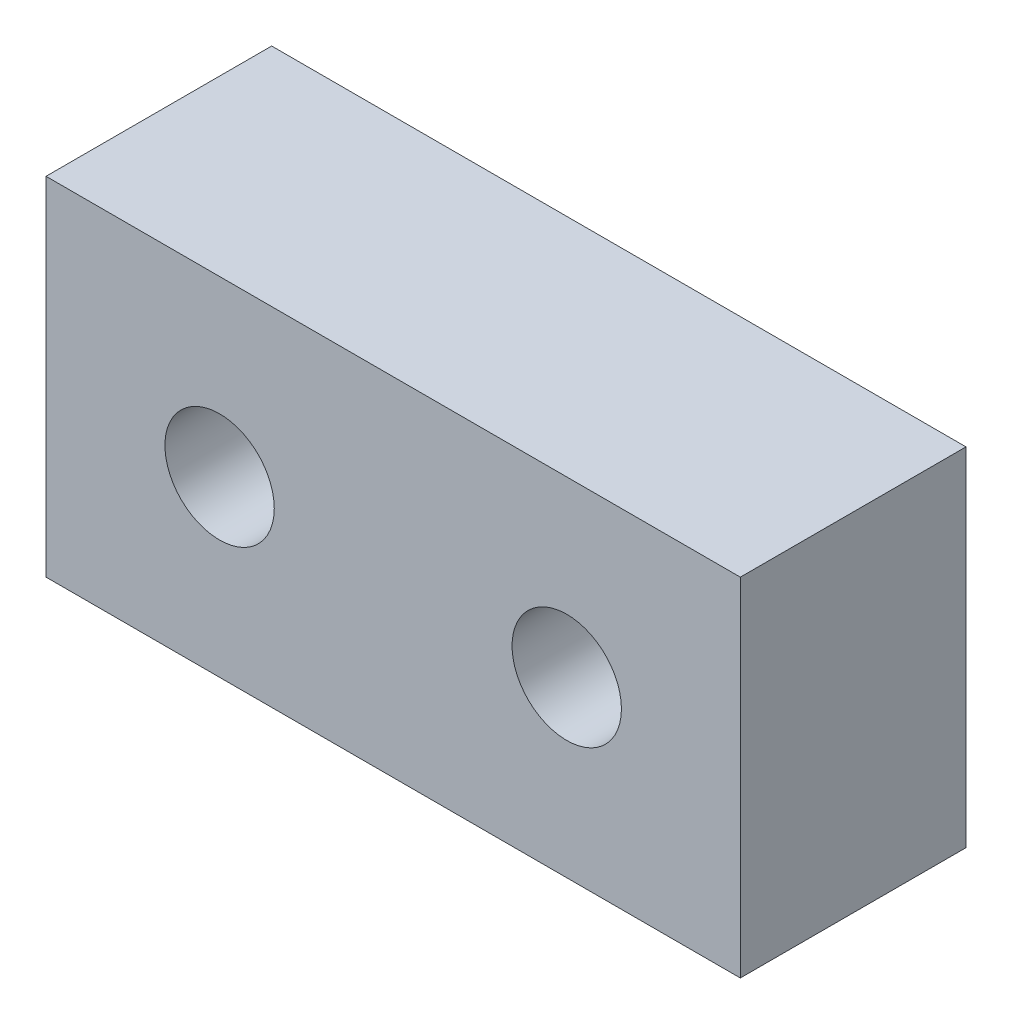
ISO-10303-21;
HEADER;
FILE_DESCRIPTION(('STEP AP214'),'2;1');
FILE_NAME('part.step','',(''),(''),'','','');
FILE_SCHEMA(('AUTOMOTIVE_DESIGN { 1 0 10303 214 1 1 1 1 }'));
ENDSEC;
DATA;
#1=APPLICATION_CONTEXT('core data for automotive mechanical design processes');
#2=APPLICATION_PROTOCOL_DEFINITION('international standard','automotive_design',2000,#1);
#3=PRODUCT_CONTEXT('',#1,'mechanical');
#4=PRODUCT('Part','Part','',(#3));
#5=PRODUCT_RELATED_PRODUCT_CATEGORY('part','',(#4));
#6=PRODUCT_DEFINITION_FORMATION('','',#4);
#7=PRODUCT_DEFINITION_CONTEXT('part definition',#1,'design');
#8=PRODUCT_DEFINITION('design','',#6,#7);
#9=PRODUCT_DEFINITION_SHAPE('','',#8);
#10=(LENGTH_UNIT() NAMED_UNIT(*) SI_UNIT(.MILLI.,.METRE.));
#11=(NAMED_UNIT(*) PLANE_ANGLE_UNIT() SI_UNIT($,.RADIAN.));
#12=(NAMED_UNIT(*) SI_UNIT($,.STERADIAN.) SOLID_ANGLE_UNIT());
#13=UNCERTAINTY_MEASURE_WITH_UNIT(LENGTH_MEASURE(1.E-05),#10,'distance_accuracy_value','');
#14=(GEOMETRIC_REPRESENTATION_CONTEXT(3) GLOBAL_UNCERTAINTY_ASSIGNED_CONTEXT((#13)) GLOBAL_UNIT_ASSIGNED_CONTEXT((#10,
#11,#12)) REPRESENTATION_CONTEXT('',''));
#15=CARTESIAN_POINT('',(0.,0.,0.));
#16=DIRECTION('',(0.,0.,1.));
#17=DIRECTION('',(1.,0.,0.));
#18=AXIS2_PLACEMENT_3D('',#15,#16,#17);
#19=CARTESIAN_POINT('',(0.,0.,6.5));
#20=DIRECTION('',(1.,0.,0.));
#21=DIRECTION('',(0.,0.,-1.));
#22=AXIS2_PLACEMENT_3D('',#19,#20,#21);
#23=PLANE('',#22);
#24=DIRECTION('',(0.,-1.,0.));
#25=VECTOR('',#24,1.);
#26=CARTESIAN_POINT('',(0.,0.,0.));
#27=LINE('',#26,#25);
#28=CARTESIAN_POINT('',(0.,0.,0.));
#29=VERTEX_POINT('',#28);
#30=CARTESIAN_POINT('',(0.,-10.,0.));
#31=VERTEX_POINT('',#30);
#32=EDGE_CURVE('E104',#29,#31,#27,.T.);
#33=ORIENTED_EDGE('',*,*,#32,.T.);
#34=DIRECTION('',(0.,0.,-1.));
#35=VECTOR('',#34,1.);
#36=CARTESIAN_POINT('',(0.,-10.,6.5));
#37=LINE('',#36,#35);
#38=CARTESIAN_POINT('',(0.,-10.,6.5));
#39=VERTEX_POINT('',#38);
#40=EDGE_CURVE('E11',#39,#31,#37,.T.);
#41=ORIENTED_EDGE('',*,*,#40,.F.);
#42=DIRECTION('',(0.,-1.,0.));
#43=VECTOR('',#42,1.);
#44=CARTESIAN_POINT('',(0.,0.,6.5));
#45=LINE('',#44,#43);
#46=CARTESIAN_POINT('',(0.,0.,6.5));
#47=VERTEX_POINT('',#46);
#48=EDGE_CURVE('E92',#47,#39,#45,.T.);
#49=ORIENTED_EDGE('',*,*,#48,.F.);
#50=DIRECTION('',(0.,0.,-1.));
#51=VECTOR('',#50,1.);
#52=CARTESIAN_POINT('',(0.,0.,6.5));
#53=LINE('',#52,#51);
#54=EDGE_CURVE('E100',#47,#29,#53,.T.);
#55=ORIENTED_EDGE('',*,*,#54,.T.);
#56=EDGE_LOOP('',(#33,#41,#49,#55));
#57=FACE_BOUND('',#56,.T.);
#58=ADVANCED_FACE('F41',(#57),#23,.F.);
#59=CARTESIAN_POINT('',(0.,-10.,6.5));
#60=DIRECTION('',(0.,1.,0.));
#61=DIRECTION('',(0.,0.,1.));
#62=AXIS2_PLACEMENT_3D('',#59,#60,#61);
#63=PLANE('',#62);
#64=DIRECTION('',(1.,0.,0.));
#65=VECTOR('',#64,1.);
#66=CARTESIAN_POINT('',(0.,-10.,0.));
#67=LINE('',#66,#65);
#68=CARTESIAN_POINT('',(20.,-10.,0.));
#69=VERTEX_POINT('',#68);
#70=EDGE_CURVE('E96',#31,#69,#67,.T.);
#71=ORIENTED_EDGE('',*,*,#70,.T.);
#72=DIRECTION('',(0.,0.,-1.));
#73=VECTOR('',#72,1.);
#74=CARTESIAN_POINT('',(20.,-10.,6.5));
#75=LINE('',#74,#73);
#76=CARTESIAN_POINT('',(20.,-10.,6.5));
#77=VERTEX_POINT('',#76);
#78=EDGE_CURVE('E49',#77,#69,#75,.T.);
#79=ORIENTED_EDGE('',*,*,#78,.F.);
#80=DIRECTION('',(1.,0.,0.));
#81=VECTOR('',#80,1.);
#82=CARTESIAN_POINT('',(0.,-10.,6.5));
#83=LINE('',#82,#81);
#84=EDGE_CURVE('E87',#39,#77,#83,.T.);
#85=ORIENTED_EDGE('',*,*,#84,.F.);
#86=ORIENTED_EDGE('',*,*,#40,.T.);
#87=EDGE_LOOP('',(#71,#79,#85,#86));
#88=FACE_BOUND('',#87,.T.);
#89=ADVANCED_FACE('F95',(#88),#63,.F.);
#90=CARTESIAN_POINT('',(20.,0.,6.5));
#91=DIRECTION('',(-1.,0.,0.));
#92=DIRECTION('',(0.,0.,1.));
#93=AXIS2_PLACEMENT_3D('',#90,#91,#92);
#94=PLANE('',#93);
#95=DIRECTION('',(0.,1.,0.));
#96=VECTOR('',#95,1.);
#97=CARTESIAN_POINT('',(20.,0.,0.));
#98=LINE('',#97,#96);
#99=CARTESIAN_POINT('',(20.,0.,0.));
#100=VERTEX_POINT('',#99);
#101=EDGE_CURVE('E74',#69,#100,#98,.T.);
#102=ORIENTED_EDGE('',*,*,#101,.T.);
#103=DIRECTION('',(0.,0.,-1.));
#104=VECTOR('',#103,1.);
#105=CARTESIAN_POINT('',(20.,0.,6.5));
#106=LINE('',#105,#104);
#107=CARTESIAN_POINT('',(20.,0.,6.5));
#108=VERTEX_POINT('',#107);
#109=EDGE_CURVE('E97',#108,#100,#106,.T.);
#110=ORIENTED_EDGE('',*,*,#109,.F.);
#111=DIRECTION('',(0.,1.,0.));
#112=VECTOR('',#111,1.);
#113=CARTESIAN_POINT('',(20.,0.,6.5));
#114=LINE('',#113,#112);
#115=EDGE_CURVE('E90',#77,#108,#114,.T.);
#116=ORIENTED_EDGE('',*,*,#115,.F.);
#117=ORIENTED_EDGE('',*,*,#78,.T.);
#118=EDGE_LOOP('',(#102,#110,#116,#117));
#119=FACE_BOUND('',#118,.T.);
#120=ADVANCED_FACE('F98',(#119),#94,.F.);
#121=CARTESIAN_POINT('',(0.,0.,6.5));
#122=DIRECTION('',(0.,-1.,0.));
#123=DIRECTION('',(0.,0.,-1.));
#124=AXIS2_PLACEMENT_3D('',#121,#122,#123);
#125=PLANE('',#124);
#126=DIRECTION('',(-1.,0.,0.));
#127=VECTOR('',#126,1.);
#128=CARTESIAN_POINT('',(0.,0.,0.));
#129=LINE('',#128,#127);
#130=EDGE_CURVE('E80',#100,#29,#129,.T.);
#131=ORIENTED_EDGE('',*,*,#130,.T.);
#132=ORIENTED_EDGE('',*,*,#54,.F.);
#133=DIRECTION('',(-1.,0.,0.));
#134=VECTOR('',#133,1.);
#135=CARTESIAN_POINT('',(0.,0.,6.5));
#136=LINE('',#135,#134);
#137=EDGE_CURVE('E57',#108,#47,#136,.T.);
#138=ORIENTED_EDGE('',*,*,#137,.F.);
#139=ORIENTED_EDGE('',*,*,#109,.T.);
#140=EDGE_LOOP('',(#131,#132,#138,#139));
#141=FACE_BOUND('',#140,.T.);
#142=ADVANCED_FACE('F112',(#141),#125,.F.);
#143=CARTESIAN_POINT('',(0.,0.,6.5));
#144=DIRECTION('',(0.,0.,1.));
#145=DIRECTION('',(1.,0.,0.));
#146=AXIS2_PLACEMENT_3D('',#143,#144,#145);
#147=PLANE('',#146);
#148=CARTESIAN_POINT('',(5.,-5.,6.5));
#149=DIRECTION('',(0.,0.,1.));
#150=DIRECTION('',(1.,0.,0.));
#151=AXIS2_PLACEMENT_3D('',#148,#149,#150);
#152=CIRCLE('',#151,1.575);
#153=CARTESIAN_POINT('',(6.575,-5.,6.5));
#154=VERTEX_POINT('',#153);
#155=EDGE_CURVE('E124',#154,#154,#152,.T.);
#156=ORIENTED_EDGE('',*,*,#155,.F.);
#157=EDGE_LOOP('',(#156));
#158=FACE_BOUND('',#157,.T.);
#159=CARTESIAN_POINT('',(15.,-5.,6.5));
#160=DIRECTION('',(0.,0.,1.));
#161=DIRECTION('',(-1.,0.,0.));
#162=AXIS2_PLACEMENT_3D('',#159,#160,#161);
#163=CIRCLE('',#162,1.575);
#164=CARTESIAN_POINT('',(16.575,-5.,6.5));
#165=VERTEX_POINT('',#164);
#166=EDGE_CURVE('E121',#165,#165,#163,.T.);
#167=ORIENTED_EDGE('',*,*,#166,.F.);
#168=EDGE_LOOP('',(#167));
#169=FACE_BOUND('',#168,.T.);
#170=ORIENTED_EDGE('',*,*,#48,.T.);
#171=ORIENTED_EDGE('',*,*,#84,.T.);
#172=ORIENTED_EDGE('',*,*,#115,.T.);
#173=ORIENTED_EDGE('',*,*,#137,.T.);
#174=EDGE_LOOP('',(#170,#171,#172,#173));
#175=FACE_BOUND('',#174,.T.);
#176=ADVANCED_FACE('F88',(#158,#169,#175),#147,.T.);
#177=CARTESIAN_POINT('',(0.,0.,0.));
#178=DIRECTION('',(0.,0.,1.));
#179=DIRECTION('',(1.,0.,0.));
#180=AXIS2_PLACEMENT_3D('',#177,#178,#179);
#181=PLANE('',#180);
#182=CARTESIAN_POINT('',(5.,-5.,0.));
#183=DIRECTION('',(0.,0.,1.));
#184=DIRECTION('',(1.,0.,0.));
#185=AXIS2_PLACEMENT_3D('',#182,#183,#184);
#186=CIRCLE('',#185,1.575);
#187=CARTESIAN_POINT('',(6.575,-5.,0.));
#188=VERTEX_POINT('',#187);
#189=EDGE_CURVE('E107',#188,#188,#186,.T.);
#190=ORIENTED_EDGE('',*,*,#189,.T.);
#191=EDGE_LOOP('',(#190));
#192=FACE_BOUND('',#191,.T.);
#193=CARTESIAN_POINT('',(15.,-5.,0.));
#194=DIRECTION('',(0.,0.,1.));
#195=DIRECTION('',(-1.,0.,0.));
#196=AXIS2_PLACEMENT_3D('',#193,#194,#195);
#197=CIRCLE('',#196,1.575);
#198=CARTESIAN_POINT('',(16.575,-5.,0.));
#199=VERTEX_POINT('',#198);
#200=EDGE_CURVE('E118',#199,#199,#197,.T.);
#201=ORIENTED_EDGE('',*,*,#200,.T.);
#202=EDGE_LOOP('',(#201));
#203=FACE_BOUND('',#202,.T.);
#204=ORIENTED_EDGE('',*,*,#32,.F.);
#205=ORIENTED_EDGE('',*,*,#130,.F.);
#206=ORIENTED_EDGE('',*,*,#101,.F.);
#207=ORIENTED_EDGE('',*,*,#70,.F.);
#208=EDGE_LOOP('',(#204,#205,#206,#207));
#209=FACE_BOUND('',#208,.T.);
#210=ADVANCED_FACE('F115',(#192,#203,#209),#181,.F.);
#211=CARTESIAN_POINT('',(15.,-5.,0.));
#212=DIRECTION('',(0.,0.,1.));
#213=DIRECTION('',(1.,0.,0.));
#214=AXIS2_PLACEMENT_3D('',#211,#212,#213);
#215=CYLINDRICAL_SURFACE('',#214,1.575);
#216=CARTESIAN_POINT('',(16.575,-5.,0.));
#217=CARTESIAN_POINT('',(16.575,-5.,0.0677083333333332));
#218=CARTESIAN_POINT('',(16.575,-5.,0.135416666666667));
#219=CARTESIAN_POINT('',(16.575,-5.,0.270833333333333));
#220=CARTESIAN_POINT('',(16.575,-5.,0.338541666666667));
#221=CARTESIAN_POINT('',(16.575,-5.,0.473958333333333));
#222=CARTESIAN_POINT('',(16.575,-5.,0.541666666666667));
#223=CARTESIAN_POINT('',(16.575,-5.,0.677083333333333));
#224=CARTESIAN_POINT('',(16.575,-5.,0.744791666666667));
#225=CARTESIAN_POINT('',(16.575,-5.,0.880208333333333));
#226=CARTESIAN_POINT('',(16.575,-5.,0.947916666666667));
#227=CARTESIAN_POINT('',(16.575,-5.,1.08333333333333));
#228=CARTESIAN_POINT('',(16.575,-5.,1.15104166666667));
#229=CARTESIAN_POINT('',(16.575,-5.,1.28645833333333));
#230=CARTESIAN_POINT('',(16.575,-5.,1.35416666666667));
#231=CARTESIAN_POINT('',(16.575,-5.,1.48958333333333));
#232=CARTESIAN_POINT('',(16.575,-5.,1.55729166666667));
#233=CARTESIAN_POINT('',(16.575,-5.,1.69270833333333));
#234=CARTESIAN_POINT('',(16.575,-5.,1.76041666666667));
#235=CARTESIAN_POINT('',(16.575,-5.,1.89583333333333));
#236=CARTESIAN_POINT('',(16.575,-5.,1.96354166666667));
#237=CARTESIAN_POINT('',(16.575,-5.,2.09895833333333));
#238=CARTESIAN_POINT('',(16.575,-5.,2.16666666666667));
#239=CARTESIAN_POINT('',(16.575,-5.,2.30208333333333));
#240=CARTESIAN_POINT('',(16.575,-5.,2.36979166666667));
#241=CARTESIAN_POINT('',(16.575,-5.,2.50520833333333));
#242=CARTESIAN_POINT('',(16.575,-5.,2.57291666666667));
#243=CARTESIAN_POINT('',(16.575,-5.,2.70833333333333));
#244=CARTESIAN_POINT('',(16.575,-5.,2.77604166666667));
#245=CARTESIAN_POINT('',(16.575,-5.,2.91145833333333));
#246=CARTESIAN_POINT('',(16.575,-5.,2.97916666666667));
#247=CARTESIAN_POINT('',(16.575,-5.,3.11458333333333));
#248=CARTESIAN_POINT('',(16.575,-5.,3.18229166666667));
#249=CARTESIAN_POINT('',(16.575,-5.,3.31770833333333));
#250=CARTESIAN_POINT('',(16.575,-5.,3.38541666666667));
#251=CARTESIAN_POINT('',(16.575,-5.,3.52083333333333));
#252=CARTESIAN_POINT('',(16.575,-5.,3.58854166666667));
#253=CARTESIAN_POINT('',(16.575,-5.,3.72395833333333));
#254=CARTESIAN_POINT('',(16.575,-5.,3.79166666666667));
#255=CARTESIAN_POINT('',(16.575,-5.,3.92708333333333));
#256=CARTESIAN_POINT('',(16.575,-5.,3.99479166666667));
#257=CARTESIAN_POINT('',(16.575,-5.,4.13020833333333));
#258=CARTESIAN_POINT('',(16.575,-5.,4.19791666666667));
#259=CARTESIAN_POINT('',(16.575,-5.,4.33333333333333));
#260=CARTESIAN_POINT('',(16.575,-5.,4.40104166666667));
#261=CARTESIAN_POINT('',(16.575,-5.,4.53645833333333));
#262=CARTESIAN_POINT('',(16.575,-5.,4.60416666666667));
#263=CARTESIAN_POINT('',(16.575,-5.,4.73958333333333));
#264=CARTESIAN_POINT('',(16.575,-5.,4.80729166666667));
#265=CARTESIAN_POINT('',(16.575,-5.,4.94270833333333));
#266=CARTESIAN_POINT('',(16.575,-5.,5.01041666666667));
#267=CARTESIAN_POINT('',(16.575,-5.,5.14583333333333));
#268=CARTESIAN_POINT('',(16.575,-5.,5.21354166666667));
#269=CARTESIAN_POINT('',(16.575,-5.,5.34895833333333));
#270=CARTESIAN_POINT('',(16.575,-5.,5.41666666666667));
#271=CARTESIAN_POINT('',(16.575,-5.,5.55208333333333));
#272=CARTESIAN_POINT('',(16.575,-5.,5.61979166666667));
#273=CARTESIAN_POINT('',(16.575,-5.,5.75520833333333));
#274=CARTESIAN_POINT('',(16.575,-5.,5.82291666666667));
#275=CARTESIAN_POINT('',(16.575,-5.,5.95833333333333));
#276=CARTESIAN_POINT('',(16.575,-5.,6.02604166666667));
#277=CARTESIAN_POINT('',(16.575,-5.,6.16145833333333));
#278=CARTESIAN_POINT('',(16.575,-5.,6.22916666666667));
#279=CARTESIAN_POINT('',(16.575,-5.,6.36458333333333));
#280=CARTESIAN_POINT('',(16.575,-5.,6.43229166666667));
#281=CARTESIAN_POINT('',(16.575,-5.,6.5));
#282=B_SPLINE_CURVE_WITH_KNOTS('',3,(#216,#217,#218,#219,#220,#221,#222,#223,#224,#225,#226,
#227,#228,#229,#230,#231,#232,#233,#234,#235,#236,#237,#238,#239,#240,#241,#242,#243,#244,#245,
#246,#247,#248,#249,#250,#251,#252,#253,#254,#255,#256,#257,#258,#259,#260,#261,#262,#263,#264,
#265,#266,#267,#268,#269,#270,#271,#272,#273,#274,#275,#276,#277,#278,#279,#280,#281),
.UNSPECIFIED.,.F.,.F.,(4,2,2,2,2,2,2,2,2,2,2,2,2,2,2,2,2,2,2,2,2,2,2,2,2,2,2,2,2,2,2,2,4),(0.,
0.203125,0.40625,0.609375,0.8125,1.015625,1.21875,1.421875,1.625,1.828125,2.03125,2.234375,
2.4375,2.640625,2.84375,3.046875,3.25,3.453125,3.65625,3.859375,4.0625,4.265625,4.46875,
4.671875,4.875,5.078125,5.28125,5.484375,5.6875,5.890625,6.09375,6.296875,6.5),.UNSPECIFIED.);
#283=EDGE_CURVE('BSEAM135',#199,#165,#282,.T.);
#284=ORIENTED_EDGE('',*,*,#200,.F.);
#285=ORIENTED_EDGE('',*,*,#166,.T.);
#286=ORIENTED_EDGE('',*,*,#283,.T.);
#287=ORIENTED_EDGE('',*,*,#283,.F.);
#288=EDGE_LOOP('',(#284,#286,#285,#287));
#289=FACE_BOUND('',#288,.T.);
#290=ADVANCED_FACE('F135',(#289),#215,.F.);
#291=CARTESIAN_POINT('',(5.,-5.,0.));
#292=DIRECTION('',(0.,0.,1.));
#293=DIRECTION('',(1.,0.,0.));
#294=AXIS2_PLACEMENT_3D('',#291,#292,#293);
#295=CYLINDRICAL_SURFACE('',#294,1.575);
#296=CARTESIAN_POINT('',(6.575,-5.,0.));
#297=CARTESIAN_POINT('',(6.575,-5.,0.0677083333333332));
#298=CARTESIAN_POINT('',(6.575,-5.,0.135416666666667));
#299=CARTESIAN_POINT('',(6.575,-5.,0.270833333333333));
#300=CARTESIAN_POINT('',(6.575,-5.,0.338541666666667));
#301=CARTESIAN_POINT('',(6.575,-5.,0.473958333333333));
#302=CARTESIAN_POINT('',(6.575,-5.,0.541666666666667));
#303=CARTESIAN_POINT('',(6.575,-5.,0.677083333333333));
#304=CARTESIAN_POINT('',(6.575,-5.,0.744791666666667));
#305=CARTESIAN_POINT('',(6.575,-5.,0.880208333333333));
#306=CARTESIAN_POINT('',(6.575,-5.,0.947916666666667));
#307=CARTESIAN_POINT('',(6.575,-5.,1.08333333333333));
#308=CARTESIAN_POINT('',(6.575,-5.,1.15104166666667));
#309=CARTESIAN_POINT('',(6.575,-5.,1.28645833333333));
#310=CARTESIAN_POINT('',(6.575,-5.,1.35416666666667));
#311=CARTESIAN_POINT('',(6.575,-5.,1.48958333333333));
#312=CARTESIAN_POINT('',(6.575,-5.,1.55729166666667));
#313=CARTESIAN_POINT('',(6.575,-5.,1.69270833333333));
#314=CARTESIAN_POINT('',(6.575,-5.,1.76041666666667));
#315=CARTESIAN_POINT('',(6.575,-5.,1.89583333333333));
#316=CARTESIAN_POINT('',(6.575,-5.,1.96354166666667));
#317=CARTESIAN_POINT('',(6.575,-5.,2.09895833333333));
#318=CARTESIAN_POINT('',(6.575,-5.,2.16666666666667));
#319=CARTESIAN_POINT('',(6.575,-5.,2.30208333333333));
#320=CARTESIAN_POINT('',(6.575,-5.,2.36979166666667));
#321=CARTESIAN_POINT('',(6.575,-5.,2.50520833333333));
#322=CARTESIAN_POINT('',(6.575,-5.,2.57291666666667));
#323=CARTESIAN_POINT('',(6.575,-5.,2.70833333333333));
#324=CARTESIAN_POINT('',(6.575,-5.,2.77604166666667));
#325=CARTESIAN_POINT('',(6.575,-5.,2.91145833333333));
#326=CARTESIAN_POINT('',(6.575,-5.,2.97916666666667));
#327=CARTESIAN_POINT('',(6.575,-5.,3.11458333333333));
#328=CARTESIAN_POINT('',(6.575,-5.,3.18229166666667));
#329=CARTESIAN_POINT('',(6.575,-5.,3.31770833333333));
#330=CARTESIAN_POINT('',(6.575,-5.,3.38541666666667));
#331=CARTESIAN_POINT('',(6.575,-5.,3.52083333333333));
#332=CARTESIAN_POINT('',(6.575,-5.,3.58854166666667));
#333=CARTESIAN_POINT('',(6.575,-5.,3.72395833333333));
#334=CARTESIAN_POINT('',(6.575,-5.,3.79166666666667));
#335=CARTESIAN_POINT('',(6.575,-5.,3.92708333333333));
#336=CARTESIAN_POINT('',(6.575,-5.,3.99479166666667));
#337=CARTESIAN_POINT('',(6.575,-5.,4.13020833333333));
#338=CARTESIAN_POINT('',(6.575,-5.,4.19791666666667));
#339=CARTESIAN_POINT('',(6.575,-5.,4.33333333333333));
#340=CARTESIAN_POINT('',(6.575,-5.,4.40104166666667));
#341=CARTESIAN_POINT('',(6.575,-5.,4.53645833333333));
#342=CARTESIAN_POINT('',(6.575,-5.,4.60416666666667));
#343=CARTESIAN_POINT('',(6.575,-5.,4.73958333333333));
#344=CARTESIAN_POINT('',(6.575,-5.,4.80729166666667));
#345=CARTESIAN_POINT('',(6.575,-5.,4.94270833333333));
#346=CARTESIAN_POINT('',(6.575,-5.,5.01041666666667));
#347=CARTESIAN_POINT('',(6.575,-5.,5.14583333333333));
#348=CARTESIAN_POINT('',(6.575,-5.,5.21354166666667));
#349=CARTESIAN_POINT('',(6.575,-5.,5.34895833333333));
#350=CARTESIAN_POINT('',(6.575,-5.,5.41666666666667));
#351=CARTESIAN_POINT('',(6.575,-5.,5.55208333333333));
#352=CARTESIAN_POINT('',(6.575,-5.,5.61979166666667));
#353=CARTESIAN_POINT('',(6.575,-5.,5.75520833333333));
#354=CARTESIAN_POINT('',(6.575,-5.,5.82291666666667));
#355=CARTESIAN_POINT('',(6.575,-5.,5.95833333333333));
#356=CARTESIAN_POINT('',(6.575,-5.,6.02604166666667));
#357=CARTESIAN_POINT('',(6.575,-5.,6.16145833333333));
#358=CARTESIAN_POINT('',(6.575,-5.,6.22916666666667));
#359=CARTESIAN_POINT('',(6.575,-5.,6.36458333333333));
#360=CARTESIAN_POINT('',(6.575,-5.,6.43229166666667));
#361=CARTESIAN_POINT('',(6.575,-5.,6.5));
#362=B_SPLINE_CURVE_WITH_KNOTS('',3,(#296,#297,#298,#299,#300,#301,#302,#303,#304,#305,#306,
#307,#308,#309,#310,#311,#312,#313,#314,#315,#316,#317,#318,#319,#320,#321,#322,#323,#324,#325,
#326,#327,#328,#329,#330,#331,#332,#333,#334,#335,#336,#337,#338,#339,#340,#341,#342,#343,#344,
#345,#346,#347,#348,#349,#350,#351,#352,#353,#354,#355,#356,#357,#358,#359,#360,#361),
.UNSPECIFIED.,.F.,.F.,(4,2,2,2,2,2,2,2,2,2,2,2,2,2,2,2,2,2,2,2,2,2,2,2,2,2,2,2,2,2,2,2,4),(0.,
0.203125,0.40625,0.609375,0.8125,1.015625,1.21875,1.421875,1.625,1.828125,2.03125,2.234375,
2.4375,2.640625,2.84375,3.046875,3.25,3.453125,3.65625,3.859375,4.0625,4.265625,4.46875,
4.671875,4.875,5.078125,5.28125,5.484375,5.6875,5.890625,6.09375,6.296875,6.5),.UNSPECIFIED.);
#363=EDGE_CURVE('BSEAM132',#188,#154,#362,.T.);
#364=ORIENTED_EDGE('',*,*,#189,.F.);
#365=ORIENTED_EDGE('',*,*,#155,.T.);
#366=ORIENTED_EDGE('',*,*,#363,.T.);
#367=ORIENTED_EDGE('',*,*,#363,.F.);
#368=EDGE_LOOP('',(#364,#366,#365,#367));
#369=FACE_BOUND('',#368,.T.);
#370=ADVANCED_FACE('F132',(#369),#295,.F.);
#371=CLOSED_SHELL('',(#58,#89,#120,#142,#176,#210,#290,#370));
#372=MANIFOLD_SOLID_BREP('B2',#371);
#373=ADVANCED_BREP_SHAPE_REPRESENTATION('',(#18,#372),#14);
#374=SHAPE_DEFINITION_REPRESENTATION(#9,#373);
ENDSEC;
END-ISO-10303-21;
